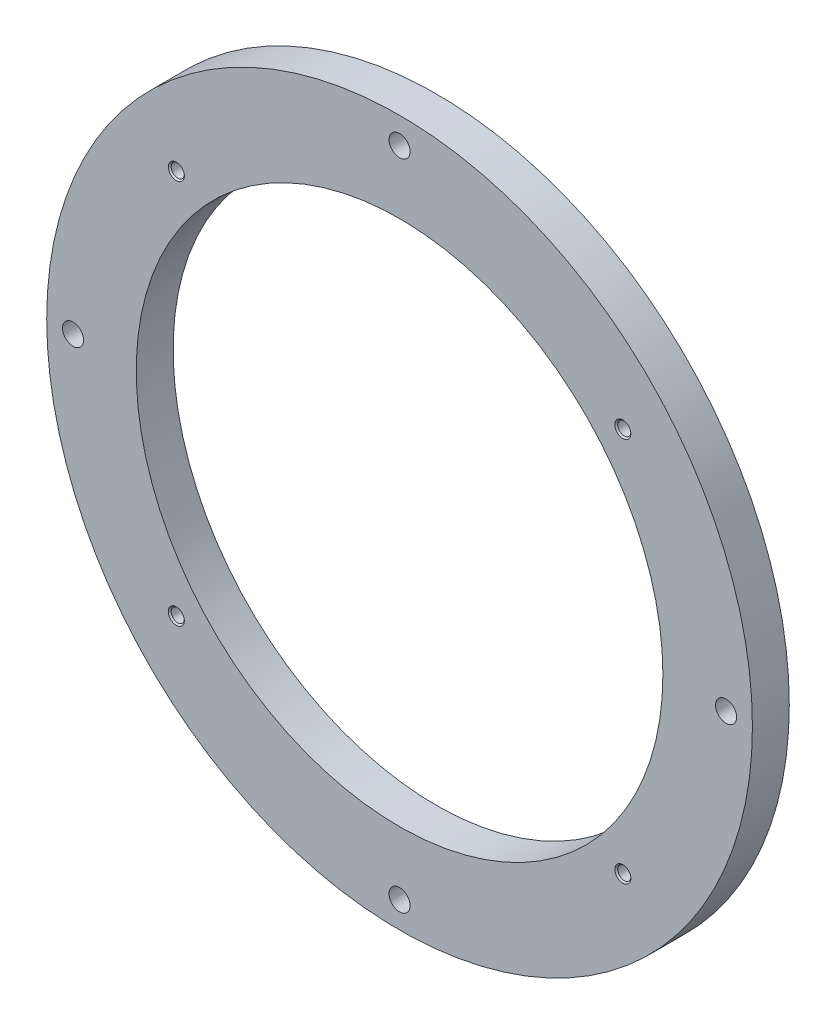
ISO-10303-21;
HEADER;
FILE_DESCRIPTION(('STEP AP214'),'2;1');
FILE_NAME('part.step','',(''),(''),'','','');
FILE_SCHEMA(('AUTOMOTIVE_DESIGN { 1 0 10303 214 1 1 1 1 }'));
ENDSEC;
DATA;
#1=APPLICATION_CONTEXT('core data for automotive mechanical design processes');
#2=APPLICATION_PROTOCOL_DEFINITION('international standard','automotive_design',2000,#1);
#3=PRODUCT_CONTEXT('',#1,'mechanical');
#4=PRODUCT('Part','Part','',(#3));
#5=PRODUCT_RELATED_PRODUCT_CATEGORY('part','',(#4));
#6=PRODUCT_DEFINITION_FORMATION('','',#4);
#7=PRODUCT_DEFINITION_CONTEXT('part definition',#1,'design');
#8=PRODUCT_DEFINITION('design','',#6,#7);
#9=PRODUCT_DEFINITION_SHAPE('','',#8);
#10=(LENGTH_UNIT() NAMED_UNIT(*) SI_UNIT(.MILLI.,.METRE.));
#11=(NAMED_UNIT(*) PLANE_ANGLE_UNIT() SI_UNIT($,.RADIAN.));
#12=(NAMED_UNIT(*) SI_UNIT($,.STERADIAN.) SOLID_ANGLE_UNIT());
#13=UNCERTAINTY_MEASURE_WITH_UNIT(LENGTH_MEASURE(1.E-05),#10,'distance_accuracy_value','');
#14=(GEOMETRIC_REPRESENTATION_CONTEXT(3) GLOBAL_UNCERTAINTY_ASSIGNED_CONTEXT((#13)) GLOBAL_UNIT_ASSIGNED_CONTEXT((#10,
#11,#12)) REPRESENTATION_CONTEXT('',''));
#15=CARTESIAN_POINT('',(0.,0.,0.));
#16=DIRECTION('',(0.,0.,1.));
#17=DIRECTION('',(1.,0.,0.));
#18=AXIS2_PLACEMENT_3D('',#15,#16,#17);
#19=CARTESIAN_POINT('',(0.,0.,7.));
#20=DIRECTION('',(0.,0.,-1.));
#21=DIRECTION('',(-1.,0.,0.));
#22=AXIS2_PLACEMENT_3D('',#19,#20,#21);
#23=CYLINDRICAL_SURFACE('',#22,67.);
#24=CARTESIAN_POINT('',(0.,0.,7.));
#25=DIRECTION('',(0.,0.,1.));
#26=DIRECTION('',(1.,0.,0.));
#27=AXIS2_PLACEMENT_3D('',#24,#25,#26);
#28=CIRCLE('',#27,67.);
#29=CARTESIAN_POINT('',(67.,0.,7.));
#30=VERTEX_POINT('',#29);
#31=EDGE_CURVE('E10',#30,#30,#28,.T.);
#32=ORIENTED_EDGE('',*,*,#31,.F.);
#33=EDGE_LOOP('',(#32));
#34=FACE_BOUND('',#33,.T.);
#35=CARTESIAN_POINT('',(0.,0.,0.));
#36=DIRECTION('',(0.,0.,1.));
#37=DIRECTION('',(1.,0.,0.));
#38=AXIS2_PLACEMENT_3D('',#35,#36,#37);
#39=CIRCLE('',#38,67.);
#40=CARTESIAN_POINT('',(67.,0.,0.));
#41=VERTEX_POINT('',#40);
#42=EDGE_CURVE('E48',#41,#41,#39,.T.);
#43=ORIENTED_EDGE('',*,*,#42,.T.);
#44=EDGE_LOOP('',(#43));
#45=FACE_BOUND('',#44,.T.);
#46=ADVANCED_FACE('F45',(#34,#45),#23,.T.);
#47=CARTESIAN_POINT('',(0.,0.,7.));
#48=DIRECTION('',(0.,0.,1.));
#49=DIRECTION('',(1.,0.,0.));
#50=AXIS2_PLACEMENT_3D('',#47,#48,#49);
#51=PLANE('',#50);
#52=CARTESIAN_POINT('',(0.,0.,7.));
#53=DIRECTION('',(0.,0.,1.));
#54=DIRECTION('',(1.,0.,0.));
#55=AXIS2_PLACEMENT_3D('',#52,#53,#54);
#56=CIRCLE('',#55,50.);
#57=CARTESIAN_POINT('',(50.,0.,7.00000000000001));
#58=VERTEX_POINT('',#57);
#59=EDGE_CURVE('E142',#58,#58,#56,.T.);
#60=ORIENTED_EDGE('',*,*,#59,.F.);
#61=EDGE_LOOP('',(#60));
#62=FACE_BOUND('',#61,.T.);
#63=CARTESIAN_POINT('',(-42.39,-36.56,7.));
#64=DIRECTION('',(0.,0.,1.));
#65=DIRECTION('',(1.,0.,0.));
#66=AXIS2_PLACEMENT_3D('',#63,#64,#65);
#67=CIRCLE('',#66,1.525);
#68=CARTESIAN_POINT('',(-40.865,-36.56,7.));
#69=VERTEX_POINT('',#68);
#70=EDGE_CURVE('E134',#69,#69,#67,.T.);
#71=ORIENTED_EDGE('',*,*,#70,.F.);
#72=EDGE_LOOP('',(#71));
#73=FACE_BOUND('',#72,.T.);
#74=CARTESIAN_POINT('',(42.39,-36.56,7.));
#75=DIRECTION('',(0.,0.,1.));
#76=DIRECTION('',(1.,0.,0.));
#77=AXIS2_PLACEMENT_3D('',#74,#75,#76);
#78=CIRCLE('',#77,1.525);
#79=CARTESIAN_POINT('',(43.915,-36.56,7.));
#80=VERTEX_POINT('',#79);
#81=EDGE_CURVE('E122',#80,#80,#78,.T.);
#82=ORIENTED_EDGE('',*,*,#81,.F.);
#83=EDGE_LOOP('',(#82));
#84=FACE_BOUND('',#83,.T.);
#85=CARTESIAN_POINT('',(42.39,36.56,7.));
#86=DIRECTION('',(0.,0.,1.));
#87=DIRECTION('',(1.,0.,0.));
#88=AXIS2_PLACEMENT_3D('',#85,#86,#87);
#89=CIRCLE('',#88,1.525);
#90=CARTESIAN_POINT('',(43.915,36.56,7.));
#91=VERTEX_POINT('',#90);
#92=EDGE_CURVE('E110',#91,#91,#89,.T.);
#93=ORIENTED_EDGE('',*,*,#92,.F.);
#94=EDGE_LOOP('',(#93));
#95=FACE_BOUND('',#94,.T.);
#96=CARTESIAN_POINT('',(-42.39,36.56,7.));
#97=DIRECTION('',(0.,0.,1.));
#98=DIRECTION('',(1.,0.,0.));
#99=AXIS2_PLACEMENT_3D('',#96,#97,#98);
#100=CIRCLE('',#99,1.525);
#101=CARTESIAN_POINT('',(-40.865,36.56,7.));
#102=VERTEX_POINT('',#101);
#103=EDGE_CURVE('E98',#102,#102,#100,.T.);
#104=ORIENTED_EDGE('',*,*,#103,.F.);
#105=EDGE_LOOP('',(#104));
#106=FACE_BOUND('',#105,.T.);
#107=CARTESIAN_POINT('',(62.,-2.16471843008274E-13,7.));
#108=DIRECTION('',(0.,0.,1.));
#109=DIRECTION('',(1.,0.,0.));
#110=AXIS2_PLACEMENT_3D('',#107,#108,#109);
#111=CIRCLE('',#110,2.);
#112=CARTESIAN_POINT('',(60.,-2.16471843008274E-13,7.));
#113=VERTEX_POINT('',#112);
#114=EDGE_CURVE('E66',#113,#113,#111,.T.);
#115=ORIENTED_EDGE('',*,*,#114,.F.);
#116=EDGE_LOOP('',(#115));
#117=FACE_BOUND('',#116,.T.);
#118=CARTESIAN_POINT('',(0.,-62.,7.));
#119=DIRECTION('',(0.,0.,1.));
#120=DIRECTION('',(1.,0.,0.));
#121=AXIS2_PLACEMENT_3D('',#118,#119,#120);
#122=CIRCLE('',#121,2.);
#123=CARTESIAN_POINT('',(-2.,-62.,7.));
#124=VERTEX_POINT('',#123);
#125=EDGE_CURVE('E77',#124,#124,#122,.T.);
#126=ORIENTED_EDGE('',*,*,#125,.F.);
#127=EDGE_LOOP('',(#126));
#128=FACE_BOUND('',#127,.T.);
#129=CARTESIAN_POINT('',(-62.,6.49415529024823E-13,7.));
#130=DIRECTION('',(0.,0.,1.));
#131=DIRECTION('',(1.,0.,0.));
#132=AXIS2_PLACEMENT_3D('',#129,#130,#131);
#133=CIRCLE('',#132,2.);
#134=CARTESIAN_POINT('',(-64.,6.49415529024823E-13,7.));
#135=VERTEX_POINT('',#134);
#136=EDGE_CURVE('E67',#135,#135,#133,.T.);
#137=ORIENTED_EDGE('',*,*,#136,.F.);
#138=EDGE_LOOP('',(#137));
#139=FACE_BOUND('',#138,.T.);
#140=CARTESIAN_POINT('',(0.,62.,7.));
#141=DIRECTION('',(0.,0.,1.));
#142=DIRECTION('',(1.,0.,0.));
#143=AXIS2_PLACEMENT_3D('',#140,#141,#142);
#144=CIRCLE('',#143,2.);
#145=CARTESIAN_POINT('',(-2.,62.,7.));
#146=VERTEX_POINT('',#145);
#147=EDGE_CURVE('E57',#146,#146,#144,.T.);
#148=ORIENTED_EDGE('',*,*,#147,.F.);
#149=EDGE_LOOP('',(#148));
#150=FACE_BOUND('',#149,.T.);
#151=ORIENTED_EDGE('',*,*,#31,.T.);
#152=EDGE_LOOP('',(#151));
#153=FACE_BOUND('',#152,.T.);
#154=ADVANCED_FACE('F149',(#62,#73,#84,#95,#106,#117,#128,#139,#150,#153),#51,.T.);
#155=CARTESIAN_POINT('',(0.,0.,0.));
#156=DIRECTION('',(0.,0.,1.));
#157=DIRECTION('',(1.,0.,0.));
#158=AXIS2_PLACEMENT_3D('',#155,#156,#157);
#159=PLANE('',#158);
#160=CARTESIAN_POINT('',(0.,0.,0.));
#161=DIRECTION('',(0.,0.,1.));
#162=DIRECTION('',(1.,0.,0.));
#163=AXIS2_PLACEMENT_3D('',#160,#161,#162);
#164=CIRCLE('',#163,50.);
#165=CARTESIAN_POINT('',(50.,0.,0.));
#166=VERTEX_POINT('',#165);
#167=EDGE_CURVE('E138',#166,#166,#164,.F.);
#168=ORIENTED_EDGE('',*,*,#167,.F.);
#169=EDGE_LOOP('',(#168));
#170=FACE_BOUND('',#169,.T.);
#171=CARTESIAN_POINT('',(-42.39,-36.56,0.));
#172=DIRECTION('',(0.,0.,1.));
#173=DIRECTION('',(1.,0.,0.));
#174=AXIS2_PLACEMENT_3D('',#171,#172,#173);
#175=CIRCLE('',#174,1.25);
#176=CARTESIAN_POINT('',(-41.14,-36.56,0.));
#177=VERTEX_POINT('',#176);
#178=EDGE_CURVE('E126',#177,#177,#175,.T.);
#179=ORIENTED_EDGE('',*,*,#178,.T.);
#180=EDGE_LOOP('',(#179));
#181=FACE_BOUND('',#180,.T.);
#182=CARTESIAN_POINT('',(42.39,-36.56,0.));
#183=DIRECTION('',(0.,0.,1.));
#184=DIRECTION('',(1.,0.,0.));
#185=AXIS2_PLACEMENT_3D('',#182,#183,#184);
#186=CIRCLE('',#185,1.25);
#187=CARTESIAN_POINT('',(43.64,-36.56,0.));
#188=VERTEX_POINT('',#187);
#189=EDGE_CURVE('E114',#188,#188,#186,.T.);
#190=ORIENTED_EDGE('',*,*,#189,.T.);
#191=EDGE_LOOP('',(#190));
#192=FACE_BOUND('',#191,.T.);
#193=CARTESIAN_POINT('',(42.39,36.56,0.));
#194=DIRECTION('',(0.,0.,1.));
#195=DIRECTION('',(1.,0.,0.));
#196=AXIS2_PLACEMENT_3D('',#193,#194,#195);
#197=CIRCLE('',#196,1.25);
#198=CARTESIAN_POINT('',(43.64,36.56,0.));
#199=VERTEX_POINT('',#198);
#200=EDGE_CURVE('E102',#199,#199,#197,.T.);
#201=ORIENTED_EDGE('',*,*,#200,.T.);
#202=EDGE_LOOP('',(#201));
#203=FACE_BOUND('',#202,.T.);
#204=CARTESIAN_POINT('',(-42.39,36.56,0.));
#205=DIRECTION('',(0.,0.,1.));
#206=DIRECTION('',(1.,0.,0.));
#207=AXIS2_PLACEMENT_3D('',#204,#205,#206);
#208=CIRCLE('',#207,1.25);
#209=CARTESIAN_POINT('',(-41.14,36.56,0.));
#210=VERTEX_POINT('',#209);
#211=EDGE_CURVE('E76',#210,#210,#208,.T.);
#212=ORIENTED_EDGE('',*,*,#211,.T.);
#213=EDGE_LOOP('',(#212));
#214=FACE_BOUND('',#213,.T.);
#215=CARTESIAN_POINT('',(62.,-2.16471843008274E-13,0.));
#216=DIRECTION('',(0.,0.,1.));
#217=DIRECTION('',(0.,-1.,0.));
#218=AXIS2_PLACEMENT_3D('',#215,#216,#217);
#219=CIRCLE('',#218,2.);
#220=CARTESIAN_POINT('',(60.,-2.16471843008274E-13,0.));
#221=VERTEX_POINT('',#220);
#222=EDGE_CURVE('E81',#221,#221,#219,.T.);
#223=ORIENTED_EDGE('',*,*,#222,.T.);
#224=EDGE_LOOP('',(#223));
#225=FACE_BOUND('',#224,.T.);
#226=CARTESIAN_POINT('',(0.,-62.,0.));
#227=DIRECTION('',(0.,0.,1.));
#228=DIRECTION('',(-1.,0.,0.));
#229=AXIS2_PLACEMENT_3D('',#226,#227,#228);
#230=CIRCLE('',#229,2.);
#231=CARTESIAN_POINT('',(-2.,-62.,0.));
#232=VERTEX_POINT('',#231);
#233=EDGE_CURVE('E71',#232,#232,#230,.T.);
#234=ORIENTED_EDGE('',*,*,#233,.T.);
#235=EDGE_LOOP('',(#234));
#236=FACE_BOUND('',#235,.T.);
#237=CARTESIAN_POINT('',(-62.,6.49415529024823E-13,0.));
#238=DIRECTION('',(0.,0.,1.));
#239=DIRECTION('',(0.,1.,0.));
#240=AXIS2_PLACEMENT_3D('',#237,#238,#239);
#241=CIRCLE('',#240,2.);
#242=CARTESIAN_POINT('',(-64.,6.49415529024823E-13,0.));
#243=VERTEX_POINT('',#242);
#244=EDGE_CURVE('E72',#243,#243,#241,.T.);
#245=ORIENTED_EDGE('',*,*,#244,.T.);
#246=EDGE_LOOP('',(#245));
#247=FACE_BOUND('',#246,.T.);
#248=CARTESIAN_POINT('',(0.,62.,0.));
#249=DIRECTION('',(0.,0.,1.));
#250=DIRECTION('',(1.,0.,0.));
#251=AXIS2_PLACEMENT_3D('',#248,#249,#250);
#252=CIRCLE('',#251,2.);
#253=CARTESIAN_POINT('',(-2.,62.,0.));
#254=VERTEX_POINT('',#253);
#255=EDGE_CURVE('E62',#254,#254,#252,.T.);
#256=ORIENTED_EDGE('',*,*,#255,.T.);
#257=EDGE_LOOP('',(#256));
#258=FACE_BOUND('',#257,.T.);
#259=ORIENTED_EDGE('',*,*,#42,.F.);
#260=EDGE_LOOP('',(#259));
#261=FACE_BOUND('',#260,.T.);
#262=ADVANCED_FACE('F152',(#170,#181,#192,#203,#214,#225,#236,#247,#258,#261),#159,.F.);
#263=CARTESIAN_POINT('',(0.,62.,12.6568542494924));
#264=DIRECTION('',(0.,0.,-1.));
#265=DIRECTION('',(-1.,0.,0.));
#266=AXIS2_PLACEMENT_3D('',#263,#264,#265);
#267=CYLINDRICAL_SURFACE('',#266,2.);
#268=CARTESIAN_POINT('',(-2.,62.,0.));
#269=CARTESIAN_POINT('',(-2.,62.,0.0729166666666648));
#270=CARTESIAN_POINT('',(-2.,62.,0.145833333333332));
#271=CARTESIAN_POINT('',(-2.,62.,0.291666666666665));
#272=CARTESIAN_POINT('',(-2.,62.,0.364583333333332));
#273=CARTESIAN_POINT('',(-2.,62.,0.510416666666665));
#274=CARTESIAN_POINT('',(-2.,62.,0.583333333333332));
#275=CARTESIAN_POINT('',(-2.,62.,0.729166666666666));
#276=CARTESIAN_POINT('',(-2.,62.,0.802083333333332));
#277=CARTESIAN_POINT('',(-2.,62.,0.947916666666666));
#278=CARTESIAN_POINT('',(-2.,62.,1.02083333333333));
#279=CARTESIAN_POINT('',(-2.,62.,1.16666666666667));
#280=CARTESIAN_POINT('',(-2.,62.,1.23958333333333));
#281=CARTESIAN_POINT('',(-2.,62.,1.38541666666667));
#282=CARTESIAN_POINT('',(-2.,62.,1.45833333333333));
#283=CARTESIAN_POINT('',(-2.,62.,1.60416666666667));
#284=CARTESIAN_POINT('',(-2.,62.,1.67708333333333));
#285=CARTESIAN_POINT('',(-2.,62.,1.82291666666667));
#286=CARTESIAN_POINT('',(-2.,62.,1.89583333333333));
#287=CARTESIAN_POINT('',(-2.,62.,2.04166666666667));
#288=CARTESIAN_POINT('',(-2.,62.,2.11458333333333));
#289=CARTESIAN_POINT('',(-2.,62.,2.26041666666667));
#290=CARTESIAN_POINT('',(-2.,62.,2.33333333333333));
#291=CARTESIAN_POINT('',(-2.,62.,2.47916666666667));
#292=CARTESIAN_POINT('',(-2.,62.,2.55208333333333));
#293=CARTESIAN_POINT('',(-2.,62.,2.69791666666667));
#294=CARTESIAN_POINT('',(-2.,62.,2.77083333333333));
#295=CARTESIAN_POINT('',(-2.,62.,2.91666666666667));
#296=CARTESIAN_POINT('',(-2.,62.,2.98958333333333));
#297=CARTESIAN_POINT('',(-2.,62.,3.13541666666667));
#298=CARTESIAN_POINT('',(-2.,62.,3.20833333333333));
#299=CARTESIAN_POINT('',(-2.,62.,3.35416666666667));
#300=CARTESIAN_POINT('',(-2.,62.,3.42708333333333));
#301=CARTESIAN_POINT('',(-2.,62.,3.57291666666667));
#302=CARTESIAN_POINT('',(-2.,62.,3.64583333333333));
#303=CARTESIAN_POINT('',(-2.,62.,3.79166666666667));
#304=CARTESIAN_POINT('',(-2.,62.,3.86458333333333));
#305=CARTESIAN_POINT('',(-2.,62.,4.01041666666667));
#306=CARTESIAN_POINT('',(-2.,62.,4.08333333333333));
#307=CARTESIAN_POINT('',(-2.,62.,4.22916666666667));
#308=CARTESIAN_POINT('',(-2.,62.,4.30208333333333));
#309=CARTESIAN_POINT('',(-2.,62.,4.44791666666667));
#310=CARTESIAN_POINT('',(-2.,62.,4.52083333333333));
#311=CARTESIAN_POINT('',(-2.,62.,4.66666666666667));
#312=CARTESIAN_POINT('',(-2.,62.,4.73958333333333));
#313=CARTESIAN_POINT('',(-2.,62.,4.88541666666667));
#314=CARTESIAN_POINT('',(-2.,62.,4.95833333333333));
#315=CARTESIAN_POINT('',(-2.,62.,5.10416666666667));
#316=CARTESIAN_POINT('',(-2.,62.,5.17708333333333));
#317=CARTESIAN_POINT('',(-2.,62.,5.32291666666667));
#318=CARTESIAN_POINT('',(-2.,62.,5.39583333333333));
#319=CARTESIAN_POINT('',(-2.,62.,5.54166666666667));
#320=CARTESIAN_POINT('',(-2.,62.,5.61458333333333));
#321=CARTESIAN_POINT('',(-2.,62.,5.76041666666667));
#322=CARTESIAN_POINT('',(-2.,62.,5.83333333333333));
#323=CARTESIAN_POINT('',(-2.,62.,5.97916666666667));
#324=CARTESIAN_POINT('',(-2.,62.,6.05208333333333));
#325=CARTESIAN_POINT('',(-2.,62.,6.19791666666667));
#326=CARTESIAN_POINT('',(-2.,62.,6.27083333333333));
#327=CARTESIAN_POINT('',(-2.,62.,6.41666666666667));
#328=CARTESIAN_POINT('',(-2.,62.,6.48958333333333));
#329=CARTESIAN_POINT('',(-2.,62.,6.63541666666667));
#330=CARTESIAN_POINT('',(-2.,62.,6.70833333333333));
#331=CARTESIAN_POINT('',(-2.,62.,6.85416666666667));
#332=CARTESIAN_POINT('',(-2.,62.,6.92708333333333));
#333=CARTESIAN_POINT('',(-2.,62.,7.));
#334=B_SPLINE_CURVE_WITH_KNOTS('',3,(#268,#269,#270,#271,#272,#273,#274,#275,#276,#277,#278,
#279,#280,#281,#282,#283,#284,#285,#286,#287,#288,#289,#290,#291,#292,#293,#294,#295,#296,#297,
#298,#299,#300,#301,#302,#303,#304,#305,#306,#307,#308,#309,#310,#311,#312,#313,#314,#315,#316,
#317,#318,#319,#320,#321,#322,#323,#324,#325,#326,#327,#328,#329,#330,#331,#332,#333),
.UNSPECIFIED.,.F.,.F.,(4,2,2,2,2,2,2,2,2,2,2,2,2,2,2,2,2,2,2,2,2,2,2,2,2,2,2,2,2,2,2,2,4),(0.,
0.21875,0.4375,0.656250000000001,0.875000000000001,1.09375,1.3125,1.53125,1.75,1.96875,2.1875,
2.40625,2.625,2.84375,3.0625,3.28125,3.5,3.71875,3.9375,4.15625,4.375,4.59375,4.8125,5.03125,
5.25,5.46875,5.6875,5.90625,6.125,6.34375,6.5625,6.78125,7.),.UNSPECIFIED.);
#335=EDGE_CURVE('BSEAM170',#254,#146,#334,.T.);
#336=ORIENTED_EDGE('',*,*,#255,.F.);
#337=ORIENTED_EDGE('',*,*,#147,.T.);
#338=ORIENTED_EDGE('',*,*,#335,.T.);
#339=ORIENTED_EDGE('',*,*,#335,.F.);
#340=EDGE_LOOP('',(#336,#338,#337,#339));
#341=FACE_BOUND('',#340,.T.);
#342=ADVANCED_FACE('F170',(#341),#267,.F.);
#343=CARTESIAN_POINT('',(-62.,6.49415529024823E-13,12.6568542494924));
#344=DIRECTION('',(0.,0.,-1.));
#345=DIRECTION('',(-1.,0.,0.));
#346=AXIS2_PLACEMENT_3D('',#343,#344,#345);
#347=CYLINDRICAL_SURFACE('',#346,2.);
#348=CARTESIAN_POINT('',(-64.,6.49415529024823E-13,0.));
#349=CARTESIAN_POINT('',(-64.,6.49415529024823E-13,0.0729166666666648));
#350=CARTESIAN_POINT('',(-64.,6.49415529024823E-13,0.145833333333332));
#351=CARTESIAN_POINT('',(-64.,6.49415529024823E-13,0.291666666666665));
#352=CARTESIAN_POINT('',(-64.,6.49415529024823E-13,0.364583333333332));
#353=CARTESIAN_POINT('',(-64.,6.49415529024823E-13,0.510416666666665));
#354=CARTESIAN_POINT('',(-64.,6.49415529024823E-13,0.583333333333332));
#355=CARTESIAN_POINT('',(-64.,6.49415529024823E-13,0.729166666666666));
#356=CARTESIAN_POINT('',(-64.,6.49415529024823E-13,0.802083333333332));
#357=CARTESIAN_POINT('',(-64.,6.49415529024823E-13,0.947916666666666));
#358=CARTESIAN_POINT('',(-64.,6.49415529024823E-13,1.02083333333333));
#359=CARTESIAN_POINT('',(-64.,6.49415529024823E-13,1.16666666666667));
#360=CARTESIAN_POINT('',(-64.,6.49415529024823E-13,1.23958333333333));
#361=CARTESIAN_POINT('',(-64.,6.49415529024823E-13,1.38541666666667));
#362=CARTESIAN_POINT('',(-64.,6.49415529024823E-13,1.45833333333333));
#363=CARTESIAN_POINT('',(-64.,6.49415529024823E-13,1.60416666666667));
#364=CARTESIAN_POINT('',(-64.,6.49415529024823E-13,1.67708333333333));
#365=CARTESIAN_POINT('',(-64.,6.49415529024823E-13,1.82291666666667));
#366=CARTESIAN_POINT('',(-64.,6.49415529024823E-13,1.89583333333333));
#367=CARTESIAN_POINT('',(-64.,6.49415529024823E-13,2.04166666666667));
#368=CARTESIAN_POINT('',(-64.,6.49415529024823E-13,2.11458333333333));
#369=CARTESIAN_POINT('',(-64.,6.49415529024823E-13,2.26041666666667));
#370=CARTESIAN_POINT('',(-64.,6.49415529024823E-13,2.33333333333333));
#371=CARTESIAN_POINT('',(-64.,6.49415529024823E-13,2.47916666666667));
#372=CARTESIAN_POINT('',(-64.,6.49415529024823E-13,2.55208333333333));
#373=CARTESIAN_POINT('',(-64.,6.49415529024823E-13,2.69791666666667));
#374=CARTESIAN_POINT('',(-64.,6.49415529024823E-13,2.77083333333333));
#375=CARTESIAN_POINT('',(-64.,6.49415529024823E-13,2.91666666666667));
#376=CARTESIAN_POINT('',(-64.,6.49415529024823E-13,2.98958333333333));
#377=CARTESIAN_POINT('',(-64.,6.49415529024823E-13,3.13541666666667));
#378=CARTESIAN_POINT('',(-64.,6.49415529024823E-13,3.20833333333333));
#379=CARTESIAN_POINT('',(-64.,6.49415529024823E-13,3.35416666666667));
#380=CARTESIAN_POINT('',(-64.,6.49415529024823E-13,3.42708333333333));
#381=CARTESIAN_POINT('',(-64.,6.49415529024823E-13,3.57291666666667));
#382=CARTESIAN_POINT('',(-64.,6.49415529024823E-13,3.64583333333333));
#383=CARTESIAN_POINT('',(-64.,6.49415529024823E-13,3.79166666666667));
#384=CARTESIAN_POINT('',(-64.,6.49415529024823E-13,3.86458333333333));
#385=CARTESIAN_POINT('',(-64.,6.49415529024823E-13,4.01041666666667));
#386=CARTESIAN_POINT('',(-64.,6.49415529024823E-13,4.08333333333333));
#387=CARTESIAN_POINT('',(-64.,6.49415529024823E-13,4.22916666666667));
#388=CARTESIAN_POINT('',(-64.,6.49415529024823E-13,4.30208333333333));
#389=CARTESIAN_POINT('',(-64.,6.49415529024823E-13,4.44791666666667));
#390=CARTESIAN_POINT('',(-64.,6.49415529024823E-13,4.52083333333333));
#391=CARTESIAN_POINT('',(-64.,6.49415529024823E-13,4.66666666666667));
#392=CARTESIAN_POINT('',(-64.,6.49415529024823E-13,4.73958333333333));
#393=CARTESIAN_POINT('',(-64.,6.49415529024823E-13,4.88541666666667));
#394=CARTESIAN_POINT('',(-64.,6.49415529024823E-13,4.95833333333333));
#395=CARTESIAN_POINT('',(-64.,6.49415529024823E-13,5.10416666666667));
#396=CARTESIAN_POINT('',(-64.,6.49415529024823E-13,5.17708333333333));
#397=CARTESIAN_POINT('',(-64.,6.49415529024823E-13,5.32291666666667));
#398=CARTESIAN_POINT('',(-64.,6.49415529024823E-13,5.39583333333333));
#399=CARTESIAN_POINT('',(-64.,6.49415529024823E-13,5.54166666666667));
#400=CARTESIAN_POINT('',(-64.,6.49415529024823E-13,5.61458333333333));
#401=CARTESIAN_POINT('',(-64.,6.49415529024823E-13,5.76041666666667));
#402=CARTESIAN_POINT('',(-64.,6.49415529024823E-13,5.83333333333333));
#403=CARTESIAN_POINT('',(-64.,6.49415529024823E-13,5.97916666666667));
#404=CARTESIAN_POINT('',(-64.,6.49415529024823E-13,6.05208333333333));
#405=CARTESIAN_POINT('',(-64.,6.49415529024823E-13,6.19791666666667));
#406=CARTESIAN_POINT('',(-64.,6.49415529024823E-13,6.27083333333333));
#407=CARTESIAN_POINT('',(-64.,6.49415529024823E-13,6.41666666666667));
#408=CARTESIAN_POINT('',(-64.,6.49415529024823E-13,6.48958333333333));
#409=CARTESIAN_POINT('',(-64.,6.49415529024823E-13,6.63541666666667));
#410=CARTESIAN_POINT('',(-64.,6.49415529024823E-13,6.70833333333333));
#411=CARTESIAN_POINT('',(-64.,6.49415529024823E-13,6.85416666666667));
#412=CARTESIAN_POINT('',(-64.,6.49415529024823E-13,6.92708333333333));
#413=CARTESIAN_POINT('',(-64.,6.49415529024823E-13,7.));
#414=B_SPLINE_CURVE_WITH_KNOTS('',3,(#348,#349,#350,#351,#352,#353,#354,#355,#356,#357,#358,
#359,#360,#361,#362,#363,#364,#365,#366,#367,#368,#369,#370,#371,#372,#373,#374,#375,#376,#377,
#378,#379,#380,#381,#382,#383,#384,#385,#386,#387,#388,#389,#390,#391,#392,#393,#394,#395,#396,
#397,#398,#399,#400,#401,#402,#403,#404,#405,#406,#407,#408,#409,#410,#411,#412,#413),
.UNSPECIFIED.,.F.,.F.,(4,2,2,2,2,2,2,2,2,2,2,2,2,2,2,2,2,2,2,2,2,2,2,2,2,2,2,2,2,2,2,2,4),(0.,
0.21875,0.4375,0.656250000000001,0.875000000000001,1.09375,1.3125,1.53125,1.75,1.96875,2.1875,
2.40625,2.625,2.84375,3.0625,3.28125,3.5,3.71875,3.9375,4.15625,4.375,4.59375,4.8125,5.03125,
5.25,5.46875,5.6875,5.90625,6.125,6.34375,6.5625,6.78125,7.),.UNSPECIFIED.);
#415=EDGE_CURVE('BSEAM172',#243,#135,#414,.T.);
#416=ORIENTED_EDGE('',*,*,#244,.F.);
#417=ORIENTED_EDGE('',*,*,#136,.T.);
#418=ORIENTED_EDGE('',*,*,#415,.T.);
#419=ORIENTED_EDGE('',*,*,#415,.F.);
#420=EDGE_LOOP('',(#416,#418,#417,#419));
#421=FACE_BOUND('',#420,.T.);
#422=ADVANCED_FACE('F172',(#421),#347,.F.);
#423=CARTESIAN_POINT('',(0.,-62.,12.6568542494924));
#424=DIRECTION('',(0.,0.,-1.));
#425=DIRECTION('',(-1.,0.,0.));
#426=AXIS2_PLACEMENT_3D('',#423,#424,#425);
#427=CYLINDRICAL_SURFACE('',#426,2.);
#428=CARTESIAN_POINT('',(-2.,-62.,0.));
#429=CARTESIAN_POINT('',(-2.,-62.,0.0729166666666648));
#430=CARTESIAN_POINT('',(-2.,-62.,0.145833333333332));
#431=CARTESIAN_POINT('',(-2.,-62.,0.291666666666665));
#432=CARTESIAN_POINT('',(-2.,-62.,0.364583333333332));
#433=CARTESIAN_POINT('',(-2.,-62.,0.510416666666665));
#434=CARTESIAN_POINT('',(-2.,-62.,0.583333333333332));
#435=CARTESIAN_POINT('',(-2.,-62.,0.729166666666666));
#436=CARTESIAN_POINT('',(-2.,-62.,0.802083333333332));
#437=CARTESIAN_POINT('',(-2.,-62.,0.947916666666666));
#438=CARTESIAN_POINT('',(-2.,-62.,1.02083333333333));
#439=CARTESIAN_POINT('',(-2.,-62.,1.16666666666667));
#440=CARTESIAN_POINT('',(-2.,-62.,1.23958333333333));
#441=CARTESIAN_POINT('',(-2.,-62.,1.38541666666667));
#442=CARTESIAN_POINT('',(-2.,-62.,1.45833333333333));
#443=CARTESIAN_POINT('',(-2.,-62.,1.60416666666667));
#444=CARTESIAN_POINT('',(-2.,-62.,1.67708333333333));
#445=CARTESIAN_POINT('',(-2.,-62.,1.82291666666667));
#446=CARTESIAN_POINT('',(-2.,-62.,1.89583333333333));
#447=CARTESIAN_POINT('',(-2.,-62.,2.04166666666667));
#448=CARTESIAN_POINT('',(-2.,-62.,2.11458333333333));
#449=CARTESIAN_POINT('',(-2.,-62.,2.26041666666667));
#450=CARTESIAN_POINT('',(-2.,-62.,2.33333333333333));
#451=CARTESIAN_POINT('',(-2.,-62.,2.47916666666667));
#452=CARTESIAN_POINT('',(-2.,-62.,2.55208333333333));
#453=CARTESIAN_POINT('',(-2.,-62.,2.69791666666667));
#454=CARTESIAN_POINT('',(-2.,-62.,2.77083333333333));
#455=CARTESIAN_POINT('',(-2.,-62.,2.91666666666667));
#456=CARTESIAN_POINT('',(-2.,-62.,2.98958333333333));
#457=CARTESIAN_POINT('',(-2.,-62.,3.13541666666667));
#458=CARTESIAN_POINT('',(-2.,-62.,3.20833333333333));
#459=CARTESIAN_POINT('',(-2.,-62.,3.35416666666667));
#460=CARTESIAN_POINT('',(-2.,-62.,3.42708333333333));
#461=CARTESIAN_POINT('',(-2.,-62.,3.57291666666667));
#462=CARTESIAN_POINT('',(-2.,-62.,3.64583333333333));
#463=CARTESIAN_POINT('',(-2.,-62.,3.79166666666667));
#464=CARTESIAN_POINT('',(-2.,-62.,3.86458333333333));
#465=CARTESIAN_POINT('',(-2.,-62.,4.01041666666667));
#466=CARTESIAN_POINT('',(-2.,-62.,4.08333333333333));
#467=CARTESIAN_POINT('',(-2.,-62.,4.22916666666667));
#468=CARTESIAN_POINT('',(-2.,-62.,4.30208333333333));
#469=CARTESIAN_POINT('',(-2.,-62.,4.44791666666667));
#470=CARTESIAN_POINT('',(-2.,-62.,4.52083333333333));
#471=CARTESIAN_POINT('',(-2.,-62.,4.66666666666667));
#472=CARTESIAN_POINT('',(-2.,-62.,4.73958333333333));
#473=CARTESIAN_POINT('',(-2.,-62.,4.88541666666667));
#474=CARTESIAN_POINT('',(-2.,-62.,4.95833333333333));
#475=CARTESIAN_POINT('',(-2.,-62.,5.10416666666667));
#476=CARTESIAN_POINT('',(-2.,-62.,5.17708333333333));
#477=CARTESIAN_POINT('',(-2.,-62.,5.32291666666667));
#478=CARTESIAN_POINT('',(-2.,-62.,5.39583333333333));
#479=CARTESIAN_POINT('',(-2.,-62.,5.54166666666667));
#480=CARTESIAN_POINT('',(-2.,-62.,5.61458333333333));
#481=CARTESIAN_POINT('',(-2.,-62.,5.76041666666667));
#482=CARTESIAN_POINT('',(-2.,-62.,5.83333333333333));
#483=CARTESIAN_POINT('',(-2.,-62.,5.97916666666667));
#484=CARTESIAN_POINT('',(-2.,-62.,6.05208333333333));
#485=CARTESIAN_POINT('',(-2.,-62.,6.19791666666667));
#486=CARTESIAN_POINT('',(-2.,-62.,6.27083333333333));
#487=CARTESIAN_POINT('',(-2.,-62.,6.41666666666667));
#488=CARTESIAN_POINT('',(-2.,-62.,6.48958333333333));
#489=CARTESIAN_POINT('',(-2.,-62.,6.63541666666667));
#490=CARTESIAN_POINT('',(-2.,-62.,6.70833333333333));
#491=CARTESIAN_POINT('',(-2.,-62.,6.85416666666667));
#492=CARTESIAN_POINT('',(-2.,-62.,6.92708333333333));
#493=CARTESIAN_POINT('',(-2.,-62.,7.));
#494=B_SPLINE_CURVE_WITH_KNOTS('',3,(#428,#429,#430,#431,#432,#433,#434,#435,#436,#437,#438,
#439,#440,#441,#442,#443,#444,#445,#446,#447,#448,#449,#450,#451,#452,#453,#454,#455,#456,#457,
#458,#459,#460,#461,#462,#463,#464,#465,#466,#467,#468,#469,#470,#471,#472,#473,#474,#475,#476,
#477,#478,#479,#480,#481,#482,#483,#484,#485,#486,#487,#488,#489,#490,#491,#492,#493),
.UNSPECIFIED.,.F.,.F.,(4,2,2,2,2,2,2,2,2,2,2,2,2,2,2,2,2,2,2,2,2,2,2,2,2,2,2,2,2,2,2,2,4),(0.,
0.21875,0.4375,0.656250000000001,0.875000000000001,1.09375,1.3125,1.53125,1.75,1.96875,2.1875,
2.40625,2.625,2.84375,3.0625,3.28125,3.5,3.71875,3.9375,4.15625,4.375,4.59375,4.8125,5.03125,
5.25,5.46875,5.6875,5.90625,6.125,6.34375,6.5625,6.78125,7.),.UNSPECIFIED.);
#495=EDGE_CURVE('BSEAM179',#232,#124,#494,.T.);
#496=ORIENTED_EDGE('',*,*,#233,.F.);
#497=ORIENTED_EDGE('',*,*,#125,.T.);
#498=ORIENTED_EDGE('',*,*,#495,.T.);
#499=ORIENTED_EDGE('',*,*,#495,.F.);
#500=EDGE_LOOP('',(#496,#498,#497,#499));
#501=FACE_BOUND('',#500,.T.);
#502=ADVANCED_FACE('F179',(#501),#427,.F.);
#503=CARTESIAN_POINT('',(62.,-2.16471843008274E-13,12.6568542494924));
#504=DIRECTION('',(0.,0.,-1.));
#505=DIRECTION('',(-1.,0.,0.));
#506=AXIS2_PLACEMENT_3D('',#503,#504,#505);
#507=CYLINDRICAL_SURFACE('',#506,2.);
#508=CARTESIAN_POINT('',(60.,-2.16471843008274E-13,0.));
#509=CARTESIAN_POINT('',(60.,-2.16471843008274E-13,0.0729166666666648));
#510=CARTESIAN_POINT('',(60.,-2.16471843008274E-13,0.145833333333332));
#511=CARTESIAN_POINT('',(60.,-2.16471843008274E-13,0.291666666666665));
#512=CARTESIAN_POINT('',(60.,-2.16471843008274E-13,0.364583333333332));
#513=CARTESIAN_POINT('',(60.,-2.16471843008274E-13,0.510416666666665));
#514=CARTESIAN_POINT('',(60.,-2.16471843008274E-13,0.583333333333332));
#515=CARTESIAN_POINT('',(60.,-2.16471843008274E-13,0.729166666666666));
#516=CARTESIAN_POINT('',(60.,-2.16471843008274E-13,0.802083333333332));
#517=CARTESIAN_POINT('',(60.,-2.16471843008274E-13,0.947916666666666));
#518=CARTESIAN_POINT('',(60.,-2.16471843008274E-13,1.02083333333333));
#519=CARTESIAN_POINT('',(60.,-2.16471843008274E-13,1.16666666666667));
#520=CARTESIAN_POINT('',(60.,-2.16471843008274E-13,1.23958333333333));
#521=CARTESIAN_POINT('',(60.,-2.16471843008274E-13,1.38541666666667));
#522=CARTESIAN_POINT('',(60.,-2.16471843008274E-13,1.45833333333333));
#523=CARTESIAN_POINT('',(60.,-2.16471843008274E-13,1.60416666666667));
#524=CARTESIAN_POINT('',(60.,-2.16471843008274E-13,1.67708333333333));
#525=CARTESIAN_POINT('',(60.,-2.16471843008274E-13,1.82291666666667));
#526=CARTESIAN_POINT('',(60.,-2.16471843008274E-13,1.89583333333333));
#527=CARTESIAN_POINT('',(60.,-2.16471843008274E-13,2.04166666666667));
#528=CARTESIAN_POINT('',(60.,-2.16471843008274E-13,2.11458333333333));
#529=CARTESIAN_POINT('',(60.,-2.16471843008274E-13,2.26041666666667));
#530=CARTESIAN_POINT('',(60.,-2.16471843008274E-13,2.33333333333333));
#531=CARTESIAN_POINT('',(60.,-2.16471843008274E-13,2.47916666666667));
#532=CARTESIAN_POINT('',(60.,-2.16471843008274E-13,2.55208333333333));
#533=CARTESIAN_POINT('',(60.,-2.16471843008274E-13,2.69791666666667));
#534=CARTESIAN_POINT('',(60.,-2.16471843008274E-13,2.77083333333333));
#535=CARTESIAN_POINT('',(60.,-2.16471843008274E-13,2.91666666666667));
#536=CARTESIAN_POINT('',(60.,-2.16471843008274E-13,2.98958333333333));
#537=CARTESIAN_POINT('',(60.,-2.16471843008274E-13,3.13541666666667));
#538=CARTESIAN_POINT('',(60.,-2.16471843008274E-13,3.20833333333333));
#539=CARTESIAN_POINT('',(60.,-2.16471843008274E-13,3.35416666666667));
#540=CARTESIAN_POINT('',(60.,-2.16471843008274E-13,3.42708333333333));
#541=CARTESIAN_POINT('',(60.,-2.16471843008274E-13,3.57291666666667));
#542=CARTESIAN_POINT('',(60.,-2.16471843008274E-13,3.64583333333333));
#543=CARTESIAN_POINT('',(60.,-2.16471843008274E-13,3.79166666666667));
#544=CARTESIAN_POINT('',(60.,-2.16471843008274E-13,3.86458333333333));
#545=CARTESIAN_POINT('',(60.,-2.16471843008274E-13,4.01041666666667));
#546=CARTESIAN_POINT('',(60.,-2.16471843008274E-13,4.08333333333333));
#547=CARTESIAN_POINT('',(60.,-2.16471843008274E-13,4.22916666666667));
#548=CARTESIAN_POINT('',(60.,-2.16471843008274E-13,4.30208333333333));
#549=CARTESIAN_POINT('',(60.,-2.16471843008274E-13,4.44791666666667));
#550=CARTESIAN_POINT('',(60.,-2.16471843008274E-13,4.52083333333333));
#551=CARTESIAN_POINT('',(60.,-2.16471843008274E-13,4.66666666666667));
#552=CARTESIAN_POINT('',(60.,-2.16471843008274E-13,4.73958333333333));
#553=CARTESIAN_POINT('',(60.,-2.16471843008274E-13,4.88541666666667));
#554=CARTESIAN_POINT('',(60.,-2.16471843008274E-13,4.95833333333333));
#555=CARTESIAN_POINT('',(60.,-2.16471843008274E-13,5.10416666666667));
#556=CARTESIAN_POINT('',(60.,-2.16471843008274E-13,5.17708333333333));
#557=CARTESIAN_POINT('',(60.,-2.16471843008274E-13,5.32291666666667));
#558=CARTESIAN_POINT('',(60.,-2.16471843008274E-13,5.39583333333333));
#559=CARTESIAN_POINT('',(60.,-2.16471843008274E-13,5.54166666666667));
#560=CARTESIAN_POINT('',(60.,-2.16471843008274E-13,5.61458333333333));
#561=CARTESIAN_POINT('',(60.,-2.16471843008274E-13,5.76041666666667));
#562=CARTESIAN_POINT('',(60.,-2.16471843008274E-13,5.83333333333333));
#563=CARTESIAN_POINT('',(60.,-2.16471843008274E-13,5.97916666666667));
#564=CARTESIAN_POINT('',(60.,-2.16471843008274E-13,6.05208333333333));
#565=CARTESIAN_POINT('',(60.,-2.16471843008274E-13,6.19791666666667));
#566=CARTESIAN_POINT('',(60.,-2.16471843008274E-13,6.27083333333333));
#567=CARTESIAN_POINT('',(60.,-2.16471843008274E-13,6.41666666666667));
#568=CARTESIAN_POINT('',(60.,-2.16471843008274E-13,6.48958333333333));
#569=CARTESIAN_POINT('',(60.,-2.16471843008274E-13,6.63541666666667));
#570=CARTESIAN_POINT('',(60.,-2.16471843008274E-13,6.70833333333333));
#571=CARTESIAN_POINT('',(60.,-2.16471843008274E-13,6.85416666666667));
#572=CARTESIAN_POINT('',(60.,-2.16471843008274E-13,6.92708333333333));
#573=CARTESIAN_POINT('',(60.,-2.16471843008274E-13,7.));
#574=B_SPLINE_CURVE_WITH_KNOTS('',3,(#508,#509,#510,#511,#512,#513,#514,#515,#516,#517,#518,
#519,#520,#521,#522,#523,#524,#525,#526,#527,#528,#529,#530,#531,#532,#533,#534,#535,#536,#537,
#538,#539,#540,#541,#542,#543,#544,#545,#546,#547,#548,#549,#550,#551,#552,#553,#554,#555,#556,
#557,#558,#559,#560,#561,#562,#563,#564,#565,#566,#567,#568,#569,#570,#571,#572,#573),
.UNSPECIFIED.,.F.,.F.,(4,2,2,2,2,2,2,2,2,2,2,2,2,2,2,2,2,2,2,2,2,2,2,2,2,2,2,2,2,2,2,2,4),(0.,
0.21875,0.4375,0.656250000000001,0.875000000000001,1.09375,1.3125,1.53125,1.75,1.96875,2.1875,
2.40625,2.625,2.84375,3.0625,3.28125,3.5,3.71875,3.9375,4.15625,4.375,4.59375,4.8125,5.03125,
5.25,5.46875,5.6875,5.90625,6.125,6.34375,6.5625,6.78125,7.),.UNSPECIFIED.);
#575=EDGE_CURVE('BSEAM276',#221,#113,#574,.T.);
#576=ORIENTED_EDGE('',*,*,#222,.F.);
#577=ORIENTED_EDGE('',*,*,#114,.T.);
#578=ORIENTED_EDGE('',*,*,#575,.T.);
#579=ORIENTED_EDGE('',*,*,#575,.F.);
#580=EDGE_LOOP('',(#576,#578,#577,#579));
#581=FACE_BOUND('',#580,.T.);
#582=ADVANCED_FACE('F276',(#581),#507,.F.);
#583=CARTESIAN_POINT('',(-42.39,36.56,7.));
#584=DIRECTION('',(0.,0.,1.));
#585=DIRECTION('',(1.,0.,0.));
#586=AXIS2_PLACEMENT_3D('',#583,#584,#585);
#587=CYLINDRICAL_SURFACE('',#586,1.25);
#588=ORIENTED_EDGE('',*,*,#211,.F.);
#589=EDGE_LOOP('',(#588));
#590=FACE_BOUND('',#589,.T.);
#591=CARTESIAN_POINT('',(-42.39,36.56,6.725));
#592=DIRECTION('',(0.,0.,1.));
#593=DIRECTION('',(1.,0.,0.));
#594=AXIS2_PLACEMENT_3D('',#591,#592,#593);
#595=CIRCLE('',#594,1.25);
#596=CARTESIAN_POINT('',(-41.14,36.56,6.725));
#597=VERTEX_POINT('',#596);
#598=EDGE_CURVE('E94',#597,#597,#595,.T.);
#599=ORIENTED_EDGE('',*,*,#598,.T.);
#600=EDGE_LOOP('',(#599));
#601=FACE_BOUND('',#600,.T.);
#602=ADVANCED_FACE('F268',(#590,#601),#587,.F.);
#603=CARTESIAN_POINT('',(-42.39,36.56,7.));
#604=DIRECTION('',(0.,0.,1.));
#605=DIRECTION('',(1.,0.,0.));
#606=AXIS2_PLACEMENT_3D('',#603,#604,#605);
#607=CONICAL_SURFACE('',#606,1.525,0.785398163397442);
#608=ORIENTED_EDGE('',*,*,#598,.F.);
#609=EDGE_LOOP('',(#608));
#610=FACE_BOUND('',#609,.T.);
#611=ORIENTED_EDGE('',*,*,#103,.T.);
#612=EDGE_LOOP('',(#611));
#613=FACE_BOUND('',#612,.T.);
#614=ADVANCED_FACE('F261',(#610,#613),#607,.F.);
#615=CARTESIAN_POINT('',(42.39,36.56,7.));
#616=DIRECTION('',(0.,0.,1.));
#617=DIRECTION('',(1.,0.,0.));
#618=AXIS2_PLACEMENT_3D('',#615,#616,#617);
#619=CYLINDRICAL_SURFACE('',#618,1.25);
#620=ORIENTED_EDGE('',*,*,#200,.F.);
#621=EDGE_LOOP('',(#620));
#622=FACE_BOUND('',#621,.T.);
#623=CARTESIAN_POINT('',(42.39,36.56,6.725));
#624=DIRECTION('',(0.,0.,1.));
#625=DIRECTION('',(1.,0.,0.));
#626=AXIS2_PLACEMENT_3D('',#623,#624,#625);
#627=CIRCLE('',#626,1.25);
#628=CARTESIAN_POINT('',(43.64,36.56,6.725));
#629=VERTEX_POINT('',#628);
#630=EDGE_CURVE('E106',#629,#629,#627,.T.);
#631=ORIENTED_EDGE('',*,*,#630,.T.);
#632=EDGE_LOOP('',(#631));
#633=FACE_BOUND('',#632,.T.);
#634=ADVANCED_FACE('F253',(#622,#633),#619,.F.);
#635=CARTESIAN_POINT('',(42.39,36.56,7.));
#636=DIRECTION('',(0.,0.,1.));
#637=DIRECTION('',(1.,0.,0.));
#638=AXIS2_PLACEMENT_3D('',#635,#636,#637);
#639=CONICAL_SURFACE('',#638,1.525,0.785398163397442);
#640=ORIENTED_EDGE('',*,*,#630,.F.);
#641=EDGE_LOOP('',(#640));
#642=FACE_BOUND('',#641,.T.);
#643=ORIENTED_EDGE('',*,*,#92,.T.);
#644=EDGE_LOOP('',(#643));
#645=FACE_BOUND('',#644,.T.);
#646=ADVANCED_FACE('F245',(#642,#645),#639,.F.);
#647=CARTESIAN_POINT('',(42.39,-36.56,7.));
#648=DIRECTION('',(0.,0.,1.));
#649=DIRECTION('',(1.,0.,0.));
#650=AXIS2_PLACEMENT_3D('',#647,#648,#649);
#651=CYLINDRICAL_SURFACE('',#650,1.25);
#652=ORIENTED_EDGE('',*,*,#189,.F.);
#653=EDGE_LOOP('',(#652));
#654=FACE_BOUND('',#653,.T.);
#655=CARTESIAN_POINT('',(42.39,-36.56,6.725));
#656=DIRECTION('',(0.,0.,1.));
#657=DIRECTION('',(1.,0.,0.));
#658=AXIS2_PLACEMENT_3D('',#655,#656,#657);
#659=CIRCLE('',#658,1.25);
#660=CARTESIAN_POINT('',(43.64,-36.56,6.725));
#661=VERTEX_POINT('',#660);
#662=EDGE_CURVE('E118',#661,#661,#659,.T.);
#663=ORIENTED_EDGE('',*,*,#662,.T.);
#664=EDGE_LOOP('',(#663));
#665=FACE_BOUND('',#664,.T.);
#666=ADVANCED_FACE('F237',(#654,#665),#651,.F.);
#667=CARTESIAN_POINT('',(42.39,-36.56,7.));
#668=DIRECTION('',(0.,0.,1.));
#669=DIRECTION('',(1.,0.,0.));
#670=AXIS2_PLACEMENT_3D('',#667,#668,#669);
#671=CONICAL_SURFACE('',#670,1.525,0.785398163397442);
#672=ORIENTED_EDGE('',*,*,#662,.F.);
#673=EDGE_LOOP('',(#672));
#674=FACE_BOUND('',#673,.T.);
#675=ORIENTED_EDGE('',*,*,#81,.T.);
#676=EDGE_LOOP('',(#675));
#677=FACE_BOUND('',#676,.T.);
#678=ADVANCED_FACE('F229',(#674,#677),#671,.F.);
#679=CARTESIAN_POINT('',(-42.39,-36.56,7.));
#680=DIRECTION('',(0.,0.,1.));
#681=DIRECTION('',(1.,0.,0.));
#682=AXIS2_PLACEMENT_3D('',#679,#680,#681);
#683=CYLINDRICAL_SURFACE('',#682,1.25);
#684=ORIENTED_EDGE('',*,*,#178,.F.);
#685=EDGE_LOOP('',(#684));
#686=FACE_BOUND('',#685,.T.);
#687=CARTESIAN_POINT('',(-42.39,-36.56,6.725));
#688=DIRECTION('',(0.,0.,1.));
#689=DIRECTION('',(1.,0.,0.));
#690=AXIS2_PLACEMENT_3D('',#687,#688,#689);
#691=CIRCLE('',#690,1.25);
#692=CARTESIAN_POINT('',(-41.14,-36.56,6.725));
#693=VERTEX_POINT('',#692);
#694=EDGE_CURVE('E130',#693,#693,#691,.T.);
#695=ORIENTED_EDGE('',*,*,#694,.T.);
#696=EDGE_LOOP('',(#695));
#697=FACE_BOUND('',#696,.T.);
#698=ADVANCED_FACE('F220',(#686,#697),#683,.F.);
#699=CARTESIAN_POINT('',(-42.39,-36.56,7.));
#700=DIRECTION('',(0.,0.,1.));
#701=DIRECTION('',(1.,0.,0.));
#702=AXIS2_PLACEMENT_3D('',#699,#700,#701);
#703=CONICAL_SURFACE('',#702,1.525,0.785398163397442);
#704=ORIENTED_EDGE('',*,*,#694,.F.);
#705=EDGE_LOOP('',(#704));
#706=FACE_BOUND('',#705,.T.);
#707=ORIENTED_EDGE('',*,*,#70,.T.);
#708=EDGE_LOOP('',(#707));
#709=FACE_BOUND('',#708,.T.);
#710=ADVANCED_FACE('F209',(#706,#709),#703,.F.);
#711=CARTESIAN_POINT('',(0.,0.,-141.42135623731));
#712=DIRECTION('',(0.,0.,1.));
#713=DIRECTION('',(1.,0.,0.));
#714=AXIS2_PLACEMENT_3D('',#711,#712,#713);
#715=CYLINDRICAL_SURFACE('',#714,50.);
#716=CARTESIAN_POINT('',(50.,0.,0.));
#717=CARTESIAN_POINT('',(50.,0.,0.0729166666666634));
#718=CARTESIAN_POINT('',(50.,0.,0.145833333333327));
#719=CARTESIAN_POINT('',(50.,0.,0.291666666666662));
#720=CARTESIAN_POINT('',(50.,0.,0.364583333333335));
#721=CARTESIAN_POINT('',(50.,0.,0.510416666666671));
#722=CARTESIAN_POINT('',(50.,0.,0.583333333333334));
#723=CARTESIAN_POINT('',(50.,0.,0.72916666666667));
#724=CARTESIAN_POINT('',(50.,0.,0.802083333333342));
#725=CARTESIAN_POINT('',(50.,0.,0.947916666666678));
#726=CARTESIAN_POINT('',(50.,0.,1.02083333333334));
#727=CARTESIAN_POINT('',(50.,0.,1.16666666666667));
#728=CARTESIAN_POINT('',(50.,0.,1.23958333333333));
#729=CARTESIAN_POINT('',(50.,0.,1.38541666666667));
#730=CARTESIAN_POINT('',(50.,0.,1.45833333333334));
#731=CARTESIAN_POINT('',(50.,0.,1.60416666666667));
#732=CARTESIAN_POINT('',(50.,0.,1.67708333333334));
#733=CARTESIAN_POINT('',(50.,0.,1.82291666666666));
#734=CARTESIAN_POINT('',(50.,0.,1.89583333333333));
#735=CARTESIAN_POINT('',(50.,0.,2.04166666666666));
#736=CARTESIAN_POINT('',(50.,0.,2.11458333333334));
#737=CARTESIAN_POINT('',(50.,0.,2.26041666666667));
#738=CARTESIAN_POINT('',(50.,0.,2.33333333333334));
#739=CARTESIAN_POINT('',(50.,0.,2.47916666666666));
#740=CARTESIAN_POINT('',(50.,0.,2.55208333333333));
#741=CARTESIAN_POINT('',(50.,0.,2.69791666666666));
#742=CARTESIAN_POINT('',(50.,0.,2.77083333333333));
#743=CARTESIAN_POINT('',(50.,0.,2.91666666666667));
#744=CARTESIAN_POINT('',(50.,0.,2.98958333333333));
#745=CARTESIAN_POINT('',(50.,0.,3.13541666666667));
#746=CARTESIAN_POINT('',(50.,0.,3.20833333333334));
#747=CARTESIAN_POINT('',(50.,0.,3.35416666666668));
#748=CARTESIAN_POINT('',(50.,0.,3.42708333333334));
#749=CARTESIAN_POINT('',(50.,0.,3.57291666666667));
#750=CARTESIAN_POINT('',(50.,0.,3.64583333333333));
#751=CARTESIAN_POINT('',(50.,0.,3.79166666666667));
#752=CARTESIAN_POINT('',(50.,0.,3.86458333333334));
#753=CARTESIAN_POINT('',(50.,0.,4.01041666666667));
#754=CARTESIAN_POINT('',(50.,0.,4.08333333333334));
#755=CARTESIAN_POINT('',(50.,0.,4.22916666666667));
#756=CARTESIAN_POINT('',(50.,0.,4.30208333333335));
#757=CARTESIAN_POINT('',(50.,0.,4.44791666666668));
#758=CARTESIAN_POINT('',(50.,0.,4.52083333333334));
#759=CARTESIAN_POINT('',(50.,0.,4.66666666666667));
#760=CARTESIAN_POINT('',(50.,0.,4.73958333333333));
#761=CARTESIAN_POINT('',(50.,0.,4.88541666666667));
#762=CARTESIAN_POINT('',(50.,0.,4.95833333333334));
#763=CARTESIAN_POINT('',(50.,0.,5.10416666666668));
#764=CARTESIAN_POINT('',(50.,0.,5.17708333333334));
#765=CARTESIAN_POINT('',(50.,0.,5.32291666666667));
#766=CARTESIAN_POINT('',(50.,0.,5.39583333333333));
#767=CARTESIAN_POINT('',(50.,0.,5.54166666666667));
#768=CARTESIAN_POINT('',(50.,0.,5.61458333333334));
#769=CARTESIAN_POINT('',(50.,0.,5.76041666666667));
#770=CARTESIAN_POINT('',(50.,0.,5.83333333333334));
#771=CARTESIAN_POINT('',(50.,0.,5.97916666666667));
#772=CARTESIAN_POINT('',(50.,0.,6.05208333333333));
#773=CARTESIAN_POINT('',(50.,0.,6.19791666666666));
#774=CARTESIAN_POINT('',(50.,0.,6.27083333333334));
#775=CARTESIAN_POINT('',(50.,0.,6.41666666666667));
#776=CARTESIAN_POINT('',(50.,0.,6.48958333333334));
#777=CARTESIAN_POINT('',(50.,0.,6.63541666666667));
#778=CARTESIAN_POINT('',(50.,0.,6.70833333333334));
#779=CARTESIAN_POINT('',(50.,0.,6.85416666666668));
#780=CARTESIAN_POINT('',(50.,0.,6.92708333333334));
#781=CARTESIAN_POINT('',(50.,0.,7.00000000000001));
#782=B_SPLINE_CURVE_WITH_KNOTS('',3,(#716,#717,#718,#719,#720,#721,#722,#723,#724,#725,#726,
#727,#728,#729,#730,#731,#732,#733,#734,#735,#736,#737,#738,#739,#740,#741,#742,#743,#744,#745,
#746,#747,#748,#749,#750,#751,#752,#753,#754,#755,#756,#757,#758,#759,#760,#761,#762,#763,#764,
#765,#766,#767,#768,#769,#770,#771,#772,#773,#774,#775,#776,#777,#778,#779,#780,#781),
.UNSPECIFIED.,.F.,.F.,(4,2,2,2,2,2,2,2,2,2,2,2,2,2,2,2,2,2,2,2,2,2,2,2,2,2,2,2,2,2,2,2,4),(0.,
0.21874999999999,0.437500000000007,0.656249999999997,0.875000000000015,1.09375,1.31249999999999,
1.53125000000001,1.75,1.96874999999999,2.18750000000001,2.40625,2.62499999999999,
2.84375000000001,3.0625,3.28125000000001,3.5,3.71874999999999,3.93750000000001,4.15625,
4.37500000000002,4.59375000000001,4.8125,5.03125000000002,5.25,5.46874999999999,
5.68750000000001,5.90625,6.12499999999999,6.34375000000001,6.5625,6.78125000000002,
7.00000000000001),.UNSPECIFIED.);
#783=EDGE_CURVE('BSEAM147',#166,#58,#782,.T.);
#784=ORIENTED_EDGE('',*,*,#167,.T.);
#785=ORIENTED_EDGE('',*,*,#59,.T.);
#786=ORIENTED_EDGE('',*,*,#783,.T.);
#787=ORIENTED_EDGE('',*,*,#783,.F.);
#788=EDGE_LOOP('',(#784,#786,#785,#787));
#789=FACE_BOUND('',#788,.T.);
#790=ADVANCED_FACE('F147',(#789),#715,.F.);
#791=CLOSED_SHELL('',(#46,#154,#262,#342,#422,#502,#582,#602,#614,#634,#646,#666,#678,#698,#710,#790));
#792=MANIFOLD_SOLID_BREP('B2',#791);
#793=ADVANCED_BREP_SHAPE_REPRESENTATION('',(#18,#792),#14);
#794=SHAPE_DEFINITION_REPRESENTATION(#9,#793);
ENDSEC;
END-ISO-10303-21;
